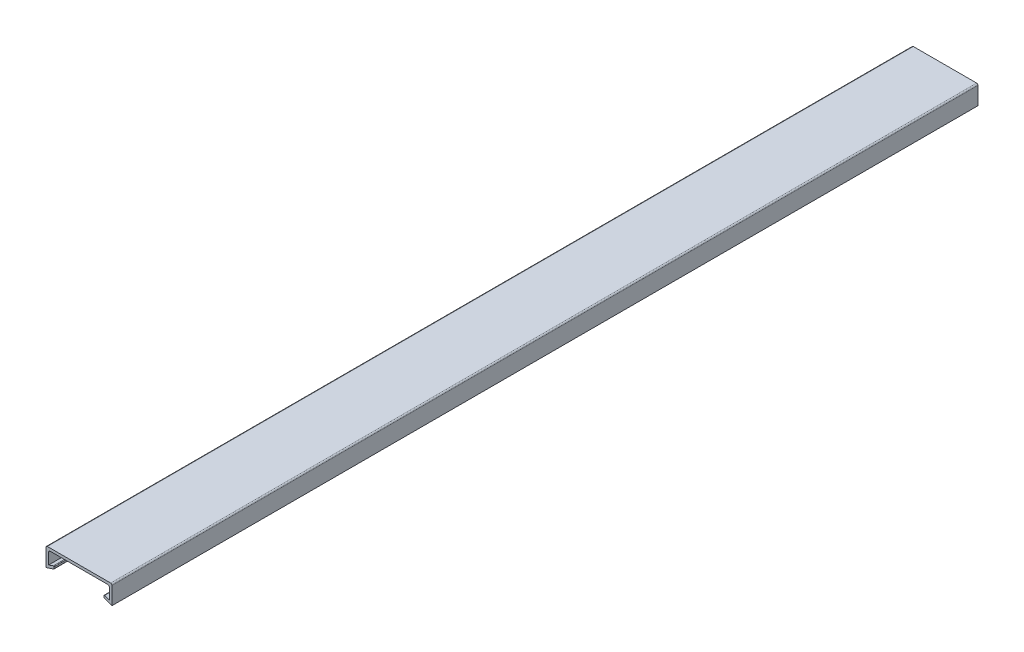
ISO-10303-21;
HEADER;
FILE_DESCRIPTION(('STEP AP214'),'2;1');
FILE_NAME('part.step','',(''),(''),'','','');
FILE_SCHEMA(('AUTOMOTIVE_DESIGN { 1 0 10303 214 1 1 1 1 }'));
ENDSEC;
DATA;
#1=APPLICATION_CONTEXT('core data for automotive mechanical design processes');
#2=APPLICATION_PROTOCOL_DEFINITION('international standard','automotive_design',2000,#1);
#3=PRODUCT_CONTEXT('',#1,'mechanical');
#4=PRODUCT('Part','Part','',(#3));
#5=PRODUCT_RELATED_PRODUCT_CATEGORY('part','',(#4));
#6=PRODUCT_DEFINITION_FORMATION('','',#4);
#7=PRODUCT_DEFINITION_CONTEXT('part definition',#1,'design');
#8=PRODUCT_DEFINITION('design','',#6,#7);
#9=PRODUCT_DEFINITION_SHAPE('','',#8);
#10=(LENGTH_UNIT() NAMED_UNIT(*) SI_UNIT(.MILLI.,.METRE.));
#11=(NAMED_UNIT(*) PLANE_ANGLE_UNIT() SI_UNIT($,.RADIAN.));
#12=(NAMED_UNIT(*) SI_UNIT($,.STERADIAN.) SOLID_ANGLE_UNIT());
#13=UNCERTAINTY_MEASURE_WITH_UNIT(LENGTH_MEASURE(1.E-05),#10,'distance_accuracy_value','');
#14=(GEOMETRIC_REPRESENTATION_CONTEXT(3) GLOBAL_UNCERTAINTY_ASSIGNED_CONTEXT((#13)) GLOBAL_UNIT_ASSIGNED_CONTEXT((#10,
#11,#12)) REPRESENTATION_CONTEXT('',''));
#15=CARTESIAN_POINT('',(0.,0.,0.));
#16=DIRECTION('',(0.,0.,1.));
#17=DIRECTION('',(1.,0.,0.));
#18=AXIS2_PLACEMENT_3D('',#15,#16,#17);
#19=CARTESIAN_POINT('',(-12.2,-7.,160.));
#20=DIRECTION('',(1.,0.,0.));
#21=DIRECTION('',(0.,0.,-1.));
#22=AXIS2_PLACEMENT_3D('',#19,#20,#21);
#23=PLANE('',#22);
#24=DIRECTION('',(0.,-1.,0.));
#25=VECTOR('',#24,1.);
#26=CARTESIAN_POINT('',(-12.2,-7.,-160.));
#27=LINE('',#26,#25);
#28=CARTESIAN_POINT('',(-12.2,-0.5,-160.));
#29=VERTEX_POINT('',#28);
#30=CARTESIAN_POINT('',(-12.2,-7.,-160.));
#31=VERTEX_POINT('',#30);
#32=EDGE_CURVE('E201',#29,#31,#27,.T.);
#33=ORIENTED_EDGE('',*,*,#32,.T.);
#34=DIRECTION('',(0.,0.,-1.));
#35=VECTOR('',#34,1.);
#36=CARTESIAN_POINT('',(-12.2,-7.,160.));
#37=LINE('',#36,#35);
#38=CARTESIAN_POINT('',(-12.2,-7.,160.));
#39=VERTEX_POINT('',#38);
#40=EDGE_CURVE('E11',#39,#31,#37,.T.);
#41=ORIENTED_EDGE('',*,*,#40,.F.);
#42=DIRECTION('',(0.,-1.,0.));
#43=VECTOR('',#42,1.);
#44=CARTESIAN_POINT('',(-12.2,-7.,160.));
#45=LINE('',#44,#43);
#46=CARTESIAN_POINT('',(-12.2,-0.5,160.));
#47=VERTEX_POINT('',#46);
#48=EDGE_CURVE('E239',#47,#39,#45,.T.);
#49=ORIENTED_EDGE('',*,*,#48,.F.);
#50=DIRECTION('',(0.,0.,-1.));
#51=VECTOR('',#50,1.);
#52=CARTESIAN_POINT('',(-12.2,-0.5,160.));
#53=LINE('',#52,#51);
#54=EDGE_CURVE('E197',#47,#29,#53,.T.);
#55=ORIENTED_EDGE('',*,*,#54,.T.);
#56=EDGE_LOOP('',(#33,#41,#49,#55));
#57=FACE_BOUND('',#56,.T.);
#58=ADVANCED_FACE('F33',(#57),#23,.F.);
#59=CARTESIAN_POINT('',(-9.33675444679663,-6.04558481559888,160.));
#60=DIRECTION('',(-0.316227766016838,0.948683298050514,0.));
#61=DIRECTION('',(-0.948683298050514,-0.316227766016838,0.));
#62=AXIS2_PLACEMENT_3D('',#59,#60,#61);
#63=PLANE('',#62);
#64=DIRECTION('',(0.948683298050514,0.316227766016838,0.));
#65=VECTOR('',#64,1.);
#66=CARTESIAN_POINT('',(-9.33675444679663,-6.04558481559888,-160.));
#67=LINE('',#66,#65);
#68=CARTESIAN_POINT('',(-9.33675444679663,-6.04558481559888,-160.));
#69=VERTEX_POINT('',#68);
#70=EDGE_CURVE('E204',#31,#69,#67,.T.);
#71=ORIENTED_EDGE('',*,*,#70,.T.);
#72=DIRECTION('',(0.,0.,-1.));
#73=VECTOR('',#72,1.);
#74=CARTESIAN_POINT('',(-9.33675444679663,-6.04558481559888,160.));
#75=LINE('',#74,#73);
#76=CARTESIAN_POINT('',(-9.33675444679663,-6.04558481559888,160.));
#77=VERTEX_POINT('',#76);
#78=EDGE_CURVE('E41',#77,#69,#75,.T.);
#79=ORIENTED_EDGE('',*,*,#78,.F.);
#80=DIRECTION('',(0.948683298050514,0.316227766016838,0.));
#81=VECTOR('',#80,1.);
#82=CARTESIAN_POINT('',(-9.33675444679663,-6.04558481559888,160.));
#83=LINE('',#82,#81);
#84=EDGE_CURVE('E128',#39,#77,#83,.T.);
#85=ORIENTED_EDGE('',*,*,#84,.F.);
#86=ORIENTED_EDGE('',*,*,#40,.T.);
#87=EDGE_LOOP('',(#71,#79,#85,#86));
#88=FACE_BOUND('',#87,.T.);
#89=ADVANCED_FACE('F357',(#88),#63,.F.);
#90=CARTESIAN_POINT('',(-9.4,-5.85584815598877,160.));
#91=DIRECTION('',(0.,0.,-1.));
#92=DIRECTION('',(-1.,0.,0.));
#93=AXIS2_PLACEMENT_3D('',#90,#91,#92);
#94=CYLINDRICAL_SURFACE('',#93,0.199999999999999);
#95=CARTESIAN_POINT('',(-9.4,-5.85584815598877,-160.));
#96=DIRECTION('',(0.,0.,1.));
#97=DIRECTION('',(1.,0.,0.));
#98=AXIS2_PLACEMENT_3D('',#95,#96,#97);
#99=CIRCLE('',#98,0.199999999999999);
#100=CARTESIAN_POINT('',(-9.2,-5.85584815598877,-160.));
#101=VERTEX_POINT('',#100);
#102=EDGE_CURVE('E206',#69,#101,#99,.T.);
#103=ORIENTED_EDGE('',*,*,#102,.T.);
#104=DIRECTION('',(0.,0.,-1.));
#105=VECTOR('',#104,1.);
#106=CARTESIAN_POINT('',(-9.2,-5.85584815598877,160.));
#107=LINE('',#106,#105);
#108=CARTESIAN_POINT('',(-9.2,-5.85584815598877,160.));
#109=VERTEX_POINT('',#108);
#110=EDGE_CURVE('E282',#109,#101,#107,.T.);
#111=ORIENTED_EDGE('',*,*,#110,.F.);
#112=CARTESIAN_POINT('',(-9.4,-5.85584815598877,160.));
#113=DIRECTION('',(0.,0.,1.));
#114=DIRECTION('',(1.,0.,0.));
#115=AXIS2_PLACEMENT_3D('',#112,#113,#114);
#116=CIRCLE('',#115,0.199999999999999);
#117=EDGE_CURVE('E290',#77,#109,#116,.T.);
#118=ORIENTED_EDGE('',*,*,#117,.F.);
#119=ORIENTED_EDGE('',*,*,#78,.T.);
#120=EDGE_LOOP('',(#103,#111,#118,#119));
#121=FACE_BOUND('',#120,.T.);
#122=ADVANCED_FACE('F288',(#121),#94,.T.);
#123=CARTESIAN_POINT('',(-9.2,-5.27748517734455,160.));
#124=DIRECTION('',(-1.,0.,0.));
#125=DIRECTION('',(0.,0.,1.));
#126=AXIS2_PLACEMENT_3D('',#123,#124,#125);
#127=PLANE('',#126);
#128=DIRECTION('',(0.,1.,0.));
#129=VECTOR('',#128,1.);
#130=CARTESIAN_POINT('',(-9.2,-5.27748517734455,-160.));
#131=LINE('',#130,#129);
#132=CARTESIAN_POINT('',(-9.2,-5.27748517734455,-160.));
#133=VERTEX_POINT('',#132);
#134=EDGE_CURVE('E208',#101,#133,#131,.T.);
#135=ORIENTED_EDGE('',*,*,#134,.T.);
#136=DIRECTION('',(0.,0.,-1.));
#137=VECTOR('',#136,1.);
#138=CARTESIAN_POINT('',(-9.2,-5.27748517734455,160.));
#139=LINE('',#138,#137);
#140=CARTESIAN_POINT('',(-9.2,-5.27748517734455,160.));
#141=VERTEX_POINT('',#140);
#142=EDGE_CURVE('E279',#141,#133,#139,.T.);
#143=ORIENTED_EDGE('',*,*,#142,.F.);
#144=DIRECTION('',(0.,1.,0.));
#145=VECTOR('',#144,1.);
#146=CARTESIAN_POINT('',(-9.2,-5.27748517734455,160.));
#147=LINE('',#146,#145);
#148=EDGE_CURVE('E308',#109,#141,#147,.T.);
#149=ORIENTED_EDGE('',*,*,#148,.F.);
#150=ORIENTED_EDGE('',*,*,#110,.T.);
#151=EDGE_LOOP('',(#135,#143,#149,#150));
#152=FACE_BOUND('',#151,.T.);
#153=ADVANCED_FACE('F299',(#152),#127,.F.);
#154=CARTESIAN_POINT('',(-9.4,-5.27748517734455,160.));
#155=DIRECTION('',(0.,0.,-1.));
#156=DIRECTION('',(-1.,0.,0.));
#157=AXIS2_PLACEMENT_3D('',#154,#155,#156);
#158=CYLINDRICAL_SURFACE('',#157,0.2);
#159=CARTESIAN_POINT('',(-9.4,-5.27748517734455,-160.));
#160=DIRECTION('',(0.,0.,1.));
#161=DIRECTION('',(-1.,0.,0.));
#162=AXIS2_PLACEMENT_3D('',#159,#160,#161);
#163=CIRCLE('',#162,0.2);
#164=CARTESIAN_POINT('',(-9.46324555320337,-5.08774851773445,-160.));
#165=VERTEX_POINT('',#164);
#166=EDGE_CURVE('E210',#133,#165,#163,.T.);
#167=ORIENTED_EDGE('',*,*,#166,.T.);
#168=DIRECTION('',(0.,0.,-1.));
#169=VECTOR('',#168,1.);
#170=CARTESIAN_POINT('',(-9.46324555320337,-5.08774851773445,160.));
#171=LINE('',#170,#169);
#172=CARTESIAN_POINT('',(-9.46324555320337,-5.08774851773445,160.));
#173=VERTEX_POINT('',#172);
#174=EDGE_CURVE('E276',#173,#165,#171,.T.);
#175=ORIENTED_EDGE('',*,*,#174,.F.);
#176=CARTESIAN_POINT('',(-9.4,-5.27748517734455,160.));
#177=DIRECTION('',(0.,0.,1.));
#178=DIRECTION('',(-1.,0.,0.));
#179=AXIS2_PLACEMENT_3D('',#176,#177,#178);
#180=CIRCLE('',#179,0.2);
#181=EDGE_CURVE('E305',#141,#173,#180,.T.);
#182=ORIENTED_EDGE('',*,*,#181,.F.);
#183=ORIENTED_EDGE('',*,*,#142,.T.);
#184=EDGE_LOOP('',(#167,#175,#182,#183));
#185=FACE_BOUND('',#184,.T.);
#186=ADVANCED_FACE('F303',(#185),#158,.T.);
#187=CARTESIAN_POINT('',(-11.2,-5.66666666666666,160.));
#188=DIRECTION('',(0.316227766016838,-0.948683298050514,0.));
#189=DIRECTION('',(0.948683298050514,0.316227766016839,0.));
#190=AXIS2_PLACEMENT_3D('',#187,#188,#189);
#191=PLANE('',#190);
#192=DIRECTION('',(-0.948683298050514,-0.316227766016838,0.));
#193=VECTOR('',#192,1.);
#194=CARTESIAN_POINT('',(-11.2,-5.66666666666666,-160.));
#195=LINE('',#194,#193);
#196=CARTESIAN_POINT('',(-11.2,-5.66666666666666,-160.));
#197=VERTEX_POINT('',#196);
#198=EDGE_CURVE('E212',#165,#197,#195,.T.);
#199=ORIENTED_EDGE('',*,*,#198,.T.);
#200=DIRECTION('',(0.,0.,-1.));
#201=VECTOR('',#200,1.);
#202=CARTESIAN_POINT('',(-11.2,-5.66666666666666,160.));
#203=LINE('',#202,#201);
#204=CARTESIAN_POINT('',(-11.2,-5.66666666666666,160.));
#205=VERTEX_POINT('',#204);
#206=EDGE_CURVE('E273',#205,#197,#203,.T.);
#207=ORIENTED_EDGE('',*,*,#206,.F.);
#208=DIRECTION('',(-0.948683298050514,-0.316227766016838,0.));
#209=VECTOR('',#208,1.);
#210=CARTESIAN_POINT('',(-11.2,-5.66666666666666,160.));
#211=LINE('',#210,#209);
#212=EDGE_CURVE('E307',#173,#205,#211,.T.);
#213=ORIENTED_EDGE('',*,*,#212,.F.);
#214=ORIENTED_EDGE('',*,*,#174,.T.);
#215=EDGE_LOOP('',(#199,#207,#213,#214));
#216=FACE_BOUND('',#215,.T.);
#217=ADVANCED_FACE('F370',(#216),#191,.F.);
#218=CARTESIAN_POINT('',(-11.2,-1.5,160.));
#219=DIRECTION('',(-1.,0.,0.));
#220=DIRECTION('',(0.,0.,1.));
#221=AXIS2_PLACEMENT_3D('',#218,#219,#220);
#222=PLANE('',#221);
#223=DIRECTION('',(0.,1.,0.));
#224=VECTOR('',#223,1.);
#225=CARTESIAN_POINT('',(-11.2,-1.5,-160.));
#226=LINE('',#225,#224);
#227=CARTESIAN_POINT('',(-11.2,-1.5,-160.));
#228=VERTEX_POINT('',#227);
#229=EDGE_CURVE('E214',#197,#228,#226,.T.);
#230=ORIENTED_EDGE('',*,*,#229,.T.);
#231=DIRECTION('',(0.,0.,-1.));
#232=VECTOR('',#231,1.);
#233=CARTESIAN_POINT('',(-11.2,-1.5,160.));
#234=LINE('',#233,#232);
#235=CARTESIAN_POINT('',(-11.2,-1.5,160.));
#236=VERTEX_POINT('',#235);
#237=EDGE_CURVE('E270',#236,#228,#234,.T.);
#238=ORIENTED_EDGE('',*,*,#237,.F.);
#239=DIRECTION('',(0.,1.,0.));
#240=VECTOR('',#239,1.);
#241=CARTESIAN_POINT('',(-11.2,-1.5,160.));
#242=LINE('',#241,#240);
#243=EDGE_CURVE('E310',#205,#236,#242,.T.);
#244=ORIENTED_EDGE('',*,*,#243,.F.);
#245=ORIENTED_EDGE('',*,*,#206,.T.);
#246=EDGE_LOOP('',(#230,#238,#244,#245));
#247=FACE_BOUND('',#246,.T.);
#248=ADVANCED_FACE('F373',(#247),#222,.F.);
#249=CARTESIAN_POINT('',(-10.7,-1.5,160.));
#250=DIRECTION('',(0.,0.,-1.));
#251=DIRECTION('',(-1.,0.,0.));
#252=AXIS2_PLACEMENT_3D('',#249,#250,#251);
#253=CYLINDRICAL_SURFACE('',#252,0.5);
#254=CARTESIAN_POINT('',(-10.7,-1.5,-160.));
#255=DIRECTION('',(0.,0.,-1.));
#256=DIRECTION('',(1.,0.,0.));
#257=AXIS2_PLACEMENT_3D('',#254,#255,#256);
#258=CIRCLE('',#257,0.5);
#259=CARTESIAN_POINT('',(-10.7,-1.,-160.));
#260=VERTEX_POINT('',#259);
#261=EDGE_CURVE('E216',#228,#260,#258,.T.);
#262=ORIENTED_EDGE('',*,*,#261,.T.);
#263=DIRECTION('',(0.,0.,-1.));
#264=VECTOR('',#263,1.);
#265=CARTESIAN_POINT('',(-10.7,-1.,160.));
#266=LINE('',#265,#264);
#267=CARTESIAN_POINT('',(-10.7,-1.,160.));
#268=VERTEX_POINT('',#267);
#269=EDGE_CURVE('E267',#268,#260,#266,.T.);
#270=ORIENTED_EDGE('',*,*,#269,.F.);
#271=CARTESIAN_POINT('',(-10.7,-1.5,160.));
#272=DIRECTION('',(0.,0.,-1.));
#273=DIRECTION('',(1.,0.,0.));
#274=AXIS2_PLACEMENT_3D('',#271,#272,#273);
#275=CIRCLE('',#274,0.5);
#276=EDGE_CURVE('E316',#236,#268,#275,.T.);
#277=ORIENTED_EDGE('',*,*,#276,.F.);
#278=ORIENTED_EDGE('',*,*,#237,.T.);
#279=EDGE_LOOP('',(#262,#270,#277,#278));
#280=FACE_BOUND('',#279,.T.);
#281=ADVANCED_FACE('F377',(#280),#253,.F.);
#282=CARTESIAN_POINT('',(10.7,-1.,160.));
#283=DIRECTION('',(0.,1.,0.));
#284=DIRECTION('',(-1.,0.,0.));
#285=AXIS2_PLACEMENT_3D('',#282,#283,#284);
#286=PLANE('',#285);
#287=DIRECTION('',(1.,0.,0.));
#288=VECTOR('',#287,1.);
#289=CARTESIAN_POINT('',(10.7,-1.,-160.));
#290=LINE('',#289,#288);
#291=CARTESIAN_POINT('',(10.7,-1.,-160.));
#292=VERTEX_POINT('',#291);
#293=EDGE_CURVE('E218',#260,#292,#290,.T.);
#294=ORIENTED_EDGE('',*,*,#293,.T.);
#295=DIRECTION('',(0.,0.,-1.));
#296=VECTOR('',#295,1.);
#297=CARTESIAN_POINT('',(10.7,-1.,160.));
#298=LINE('',#297,#296);
#299=CARTESIAN_POINT('',(10.7,-1.,160.));
#300=VERTEX_POINT('',#299);
#301=EDGE_CURVE('E264',#300,#292,#298,.T.);
#302=ORIENTED_EDGE('',*,*,#301,.F.);
#303=DIRECTION('',(1.,0.,0.));
#304=VECTOR('',#303,1.);
#305=CARTESIAN_POINT('',(10.7,-1.,160.));
#306=LINE('',#305,#304);
#307=EDGE_CURVE('E318',#268,#300,#306,.T.);
#308=ORIENTED_EDGE('',*,*,#307,.F.);
#309=ORIENTED_EDGE('',*,*,#269,.T.);
#310=EDGE_LOOP('',(#294,#302,#308,#309));
#311=FACE_BOUND('',#310,.T.);
#312=ADVANCED_FACE('F381',(#311),#286,.F.);
#313=CARTESIAN_POINT('',(10.7,-1.5,160.));
#314=DIRECTION('',(0.,0.,-1.));
#315=DIRECTION('',(-1.,0.,0.));
#316=AXIS2_PLACEMENT_3D('',#313,#314,#315);
#317=CYLINDRICAL_SURFACE('',#316,0.5);
#318=CARTESIAN_POINT('',(10.7,-1.5,-160.));
#319=DIRECTION('',(0.,0.,-1.));
#320=DIRECTION('',(1.,0.,0.));
#321=AXIS2_PLACEMENT_3D('',#318,#319,#320);
#322=CIRCLE('',#321,0.5);
#323=CARTESIAN_POINT('',(11.2,-1.5,-160.));
#324=VERTEX_POINT('',#323);
#325=EDGE_CURVE('E220',#292,#324,#322,.T.);
#326=ORIENTED_EDGE('',*,*,#325,.T.);
#327=DIRECTION('',(0.,0.,-1.));
#328=VECTOR('',#327,1.);
#329=CARTESIAN_POINT('',(11.2,-1.5,160.));
#330=LINE('',#329,#328);
#331=CARTESIAN_POINT('',(11.2,-1.5,160.));
#332=VERTEX_POINT('',#331);
#333=EDGE_CURVE('E261',#332,#324,#330,.T.);
#334=ORIENTED_EDGE('',*,*,#333,.F.);
#335=CARTESIAN_POINT('',(10.7,-1.5,160.));
#336=DIRECTION('',(0.,0.,-1.));
#337=DIRECTION('',(1.,0.,0.));
#338=AXIS2_PLACEMENT_3D('',#335,#336,#337);
#339=CIRCLE('',#338,0.5);
#340=EDGE_CURVE('E320',#300,#332,#339,.T.);
#341=ORIENTED_EDGE('',*,*,#340,.F.);
#342=ORIENTED_EDGE('',*,*,#301,.T.);
#343=EDGE_LOOP('',(#326,#334,#341,#342));
#344=FACE_BOUND('',#343,.T.);
#345=ADVANCED_FACE('F385',(#344),#317,.F.);
#346=CARTESIAN_POINT('',(11.2,-5.66666666666666,160.));
#347=DIRECTION('',(1.,0.,0.));
#348=DIRECTION('',(0.,0.,-1.));
#349=AXIS2_PLACEMENT_3D('',#346,#347,#348);
#350=PLANE('',#349);
#351=DIRECTION('',(0.,-1.,0.));
#352=VECTOR('',#351,1.);
#353=CARTESIAN_POINT('',(11.2,-5.66666666666666,-160.));
#354=LINE('',#353,#352);
#355=CARTESIAN_POINT('',(11.2,-5.66666666666666,-160.));
#356=VERTEX_POINT('',#355);
#357=EDGE_CURVE('E222',#324,#356,#354,.T.);
#358=ORIENTED_EDGE('',*,*,#357,.T.);
#359=DIRECTION('',(0.,0.,-1.));
#360=VECTOR('',#359,1.);
#361=CARTESIAN_POINT('',(11.2,-5.66666666666666,160.));
#362=LINE('',#361,#360);
#363=CARTESIAN_POINT('',(11.2,-5.66666666666666,160.));
#364=VERTEX_POINT('',#363);
#365=EDGE_CURVE('E258',#364,#356,#362,.T.);
#366=ORIENTED_EDGE('',*,*,#365,.F.);
#367=DIRECTION('',(0.,-1.,0.));
#368=VECTOR('',#367,1.);
#369=CARTESIAN_POINT('',(11.2,-5.66666666666666,160.));
#370=LINE('',#369,#368);
#371=EDGE_CURVE('E322',#332,#364,#370,.T.);
#372=ORIENTED_EDGE('',*,*,#371,.F.);
#373=ORIENTED_EDGE('',*,*,#333,.T.);
#374=EDGE_LOOP('',(#358,#366,#372,#373));
#375=FACE_BOUND('',#374,.T.);
#376=ADVANCED_FACE('F389',(#375),#350,.F.);
#377=CARTESIAN_POINT('',(11.2,-5.66666666666666,160.));
#378=DIRECTION('',(-0.316227766016838,-0.948683298050514,0.));
#379=DIRECTION('',(0.948683298050514,-0.316227766016839,0.));
#380=AXIS2_PLACEMENT_3D('',#377,#378,#379);
#381=PLANE('',#380);
#382=DIRECTION('',(-0.948683298050514,0.316227766016838,0.));
#383=VECTOR('',#382,1.);
#384=CARTESIAN_POINT('',(11.2,-5.66666666666666,-160.));
#385=LINE('',#384,#383);
#386=CARTESIAN_POINT('',(9.46324555320337,-5.08774851773445,-160.));
#387=VERTEX_POINT('',#386);
#388=EDGE_CURVE('E224',#356,#387,#385,.T.);
#389=ORIENTED_EDGE('',*,*,#388,.T.);
#390=DIRECTION('',(0.,0.,-1.));
#391=VECTOR('',#390,1.);
#392=CARTESIAN_POINT('',(9.46324555320337,-5.08774851773445,160.));
#393=LINE('',#392,#391);
#394=CARTESIAN_POINT('',(9.46324555320337,-5.08774851773445,160.));
#395=VERTEX_POINT('',#394);
#396=EDGE_CURVE('E255',#395,#387,#393,.T.);
#397=ORIENTED_EDGE('',*,*,#396,.F.);
#398=DIRECTION('',(-0.948683298050514,0.316227766016838,0.));
#399=VECTOR('',#398,1.);
#400=CARTESIAN_POINT('',(11.2,-5.66666666666666,160.));
#401=LINE('',#400,#399);
#402=EDGE_CURVE('E324',#364,#395,#401,.T.);
#403=ORIENTED_EDGE('',*,*,#402,.F.);
#404=ORIENTED_EDGE('',*,*,#365,.T.);
#405=EDGE_LOOP('',(#389,#397,#403,#404));
#406=FACE_BOUND('',#405,.T.);
#407=ADVANCED_FACE('F393',(#406),#381,.F.);
#408=CARTESIAN_POINT('',(9.4,-5.27748517734455,160.));
#409=DIRECTION('',(0.,0.,-1.));
#410=DIRECTION('',(-1.,0.,0.));
#411=AXIS2_PLACEMENT_3D('',#408,#409,#410);
#412=CYLINDRICAL_SURFACE('',#411,0.2);
#413=CARTESIAN_POINT('',(9.4,-5.27748517734455,-160.));
#414=DIRECTION('',(0.,0.,1.));
#415=DIRECTION('',(-1.,0.,0.));
#416=AXIS2_PLACEMENT_3D('',#413,#414,#415);
#417=CIRCLE('',#416,0.2);
#418=CARTESIAN_POINT('',(9.2,-5.27748517734455,-160.));
#419=VERTEX_POINT('',#418);
#420=EDGE_CURVE('E226',#387,#419,#417,.T.);
#421=ORIENTED_EDGE('',*,*,#420,.T.);
#422=DIRECTION('',(0.,0.,-1.));
#423=VECTOR('',#422,1.);
#424=CARTESIAN_POINT('',(9.2,-5.27748517734455,160.));
#425=LINE('',#424,#423);
#426=CARTESIAN_POINT('',(9.2,-5.27748517734455,160.));
#427=VERTEX_POINT('',#426);
#428=EDGE_CURVE('E252',#427,#419,#425,.T.);
#429=ORIENTED_EDGE('',*,*,#428,.F.);
#430=CARTESIAN_POINT('',(9.4,-5.27748517734455,160.));
#431=DIRECTION('',(0.,0.,1.));
#432=DIRECTION('',(-1.,0.,0.));
#433=AXIS2_PLACEMENT_3D('',#430,#431,#432);
#434=CIRCLE('',#433,0.2);
#435=EDGE_CURVE('E326',#395,#427,#434,.T.);
#436=ORIENTED_EDGE('',*,*,#435,.F.);
#437=ORIENTED_EDGE('',*,*,#396,.T.);
#438=EDGE_LOOP('',(#421,#429,#436,#437));
#439=FACE_BOUND('',#438,.T.);
#440=ADVANCED_FACE('F397',(#439),#412,.T.);
#441=CARTESIAN_POINT('',(9.2,-5.27748517734455,160.));
#442=DIRECTION('',(1.,0.,0.));
#443=DIRECTION('',(0.,0.,-1.));
#444=AXIS2_PLACEMENT_3D('',#441,#442,#443);
#445=PLANE('',#444);
#446=DIRECTION('',(0.,-1.,0.));
#447=VECTOR('',#446,1.);
#448=CARTESIAN_POINT('',(9.2,-5.27748517734455,-160.));
#449=LINE('',#448,#447);
#450=CARTESIAN_POINT('',(9.2,-5.85584815598877,-160.));
#451=VERTEX_POINT('',#450);
#452=EDGE_CURVE('E228',#419,#451,#449,.T.);
#453=ORIENTED_EDGE('',*,*,#452,.T.);
#454=DIRECTION('',(0.,0.,-1.));
#455=VECTOR('',#454,1.);
#456=CARTESIAN_POINT('',(9.2,-5.85584815598877,160.));
#457=LINE('',#456,#455);
#458=CARTESIAN_POINT('',(9.2,-5.85584815598877,160.));
#459=VERTEX_POINT('',#458);
#460=EDGE_CURVE('E249',#459,#451,#457,.T.);
#461=ORIENTED_EDGE('',*,*,#460,.F.);
#462=DIRECTION('',(0.,-1.,0.));
#463=VECTOR('',#462,1.);
#464=CARTESIAN_POINT('',(9.2,-5.27748517734455,160.));
#465=LINE('',#464,#463);
#466=EDGE_CURVE('E328',#427,#459,#465,.T.);
#467=ORIENTED_EDGE('',*,*,#466,.F.);
#468=ORIENTED_EDGE('',*,*,#428,.T.);
#469=EDGE_LOOP('',(#453,#461,#467,#468));
#470=FACE_BOUND('',#469,.T.);
#471=ADVANCED_FACE('F401',(#470),#445,.F.);
#472=CARTESIAN_POINT('',(9.4,-5.85584815598877,160.));
#473=DIRECTION('',(0.,0.,-1.));
#474=DIRECTION('',(-1.,0.,0.));
#475=AXIS2_PLACEMENT_3D('',#472,#473,#474);
#476=CYLINDRICAL_SURFACE('',#475,0.199999999999999);
#477=CARTESIAN_POINT('',(9.4,-5.85584815598877,-160.));
#478=DIRECTION('',(0.,0.,1.));
#479=DIRECTION('',(1.,0.,0.));
#480=AXIS2_PLACEMENT_3D('',#477,#478,#479);
#481=CIRCLE('',#480,0.199999999999999);
#482=CARTESIAN_POINT('',(9.33675444679663,-6.04558481559888,-160.));
#483=VERTEX_POINT('',#482);
#484=EDGE_CURVE('E230',#451,#483,#481,.T.);
#485=ORIENTED_EDGE('',*,*,#484,.T.);
#486=DIRECTION('',(0.,0.,-1.));
#487=VECTOR('',#486,1.);
#488=CARTESIAN_POINT('',(9.33675444679663,-6.04558481559888,160.));
#489=LINE('',#488,#487);
#490=CARTESIAN_POINT('',(9.33675444679663,-6.04558481559888,160.));
#491=VERTEX_POINT('',#490);
#492=EDGE_CURVE('E246',#491,#483,#489,.T.);
#493=ORIENTED_EDGE('',*,*,#492,.F.);
#494=CARTESIAN_POINT('',(9.4,-5.85584815598877,160.));
#495=DIRECTION('',(0.,0.,1.));
#496=DIRECTION('',(1.,0.,0.));
#497=AXIS2_PLACEMENT_3D('',#494,#495,#496);
#498=CIRCLE('',#497,0.199999999999999);
#499=EDGE_CURVE('E330',#459,#491,#498,.T.);
#500=ORIENTED_EDGE('',*,*,#499,.F.);
#501=ORIENTED_EDGE('',*,*,#460,.T.);
#502=EDGE_LOOP('',(#485,#493,#500,#501));
#503=FACE_BOUND('',#502,.T.);
#504=ADVANCED_FACE('F405',(#503),#476,.T.);
#505=CARTESIAN_POINT('',(9.33675444679663,-6.04558481559888,160.));
#506=DIRECTION('',(0.316227766016838,0.948683298050514,0.));
#507=DIRECTION('',(-0.948683298050514,0.316227766016838,0.));
#508=AXIS2_PLACEMENT_3D('',#505,#506,#507);
#509=PLANE('',#508);
#510=DIRECTION('',(0.948683298050514,-0.316227766016838,0.));
#511=VECTOR('',#510,1.);
#512=CARTESIAN_POINT('',(9.33675444679663,-6.04558481559888,-160.));
#513=LINE('',#512,#511);
#514=CARTESIAN_POINT('',(12.2,-7.,-160.));
#515=VERTEX_POINT('',#514);
#516=EDGE_CURVE('E232',#483,#515,#513,.T.);
#517=ORIENTED_EDGE('',*,*,#516,.T.);
#518=DIRECTION('',(0.,0.,-1.));
#519=VECTOR('',#518,1.);
#520=CARTESIAN_POINT('',(12.2,-7.,160.));
#521=LINE('',#520,#519);
#522=CARTESIAN_POINT('',(12.2,-7.,160.));
#523=VERTEX_POINT('',#522);
#524=EDGE_CURVE('E243',#523,#515,#521,.T.);
#525=ORIENTED_EDGE('',*,*,#524,.F.);
#526=DIRECTION('',(0.948683298050514,-0.316227766016838,0.));
#527=VECTOR('',#526,1.);
#528=CARTESIAN_POINT('',(9.33675444679663,-6.04558481559888,160.));
#529=LINE('',#528,#527);
#530=EDGE_CURVE('E332',#491,#523,#529,.T.);
#531=ORIENTED_EDGE('',*,*,#530,.F.);
#532=ORIENTED_EDGE('',*,*,#492,.T.);
#533=EDGE_LOOP('',(#517,#525,#531,#532));
#534=FACE_BOUND('',#533,.T.);
#535=ADVANCED_FACE('F338',(#534),#509,.F.);
#536=CARTESIAN_POINT('',(12.2,-0.5,160.));
#537=DIRECTION('',(-1.,0.,0.));
#538=DIRECTION('',(0.,0.,1.));
#539=AXIS2_PLACEMENT_3D('',#536,#537,#538);
#540=PLANE('',#539);
#541=DIRECTION('',(0.,1.,0.));
#542=VECTOR('',#541,1.);
#543=CARTESIAN_POINT('',(12.2,-0.5,-160.));
#544=LINE('',#543,#542);
#545=CARTESIAN_POINT('',(12.2,-0.5,-160.));
#546=VERTEX_POINT('',#545);
#547=EDGE_CURVE('E234',#515,#546,#544,.T.);
#548=ORIENTED_EDGE('',*,*,#547,.T.);
#549=DIRECTION('',(0.,0.,-1.));
#550=VECTOR('',#549,1.);
#551=CARTESIAN_POINT('',(12.2,-0.5,160.));
#552=LINE('',#551,#550);
#553=CARTESIAN_POINT('',(12.2,-0.5,160.));
#554=VERTEX_POINT('',#553);
#555=EDGE_CURVE('E192',#554,#546,#552,.T.);
#556=ORIENTED_EDGE('',*,*,#555,.F.);
#557=DIRECTION('',(0.,1.,0.));
#558=VECTOR('',#557,1.);
#559=CARTESIAN_POINT('',(12.2,-0.5,160.));
#560=LINE('',#559,#558);
#561=EDGE_CURVE('E183',#523,#554,#560,.T.);
#562=ORIENTED_EDGE('',*,*,#561,.F.);
#563=ORIENTED_EDGE('',*,*,#524,.T.);
#564=EDGE_LOOP('',(#548,#556,#562,#563));
#565=FACE_BOUND('',#564,.T.);
#566=ADVANCED_FACE('F342',(#565),#540,.F.);
#567=CARTESIAN_POINT('',(11.7,-0.5,160.));
#568=DIRECTION('',(0.,0.,-1.));
#569=DIRECTION('',(-1.,0.,0.));
#570=AXIS2_PLACEMENT_3D('',#567,#568,#569);
#571=CYLINDRICAL_SURFACE('',#570,0.5);
#572=CARTESIAN_POINT('',(11.7,-0.5,-160.));
#573=DIRECTION('',(0.,0.,1.));
#574=DIRECTION('',(-1.,0.,0.));
#575=AXIS2_PLACEMENT_3D('',#572,#573,#574);
#576=CIRCLE('',#575,0.5);
#577=CARTESIAN_POINT('',(11.7,0.,-160.));
#578=VERTEX_POINT('',#577);
#579=EDGE_CURVE('E191',#546,#578,#576,.T.);
#580=ORIENTED_EDGE('',*,*,#579,.T.);
#581=DIRECTION('',(0.,0.,-1.));
#582=VECTOR('',#581,1.);
#583=CARTESIAN_POINT('',(11.7,0.,160.));
#584=LINE('',#583,#582);
#585=CARTESIAN_POINT('',(11.7,0.,160.));
#586=VERTEX_POINT('',#585);
#587=EDGE_CURVE('E188',#586,#578,#584,.T.);
#588=ORIENTED_EDGE('',*,*,#587,.F.);
#589=CARTESIAN_POINT('',(11.7,-0.5,160.));
#590=DIRECTION('',(0.,0.,1.));
#591=DIRECTION('',(-1.,0.,0.));
#592=AXIS2_PLACEMENT_3D('',#589,#590,#591);
#593=CIRCLE('',#592,0.5);
#594=EDGE_CURVE('E177',#554,#586,#593,.T.);
#595=ORIENTED_EDGE('',*,*,#594,.F.);
#596=ORIENTED_EDGE('',*,*,#555,.T.);
#597=EDGE_LOOP('',(#580,#588,#595,#596));
#598=FACE_BOUND('',#597,.T.);
#599=ADVANCED_FACE('F189',(#598),#571,.T.);
#600=CARTESIAN_POINT('',(-11.7,0.,160.));
#601=DIRECTION('',(0.,-1.,0.));
#602=DIRECTION('',(0.,0.,-1.));
#603=AXIS2_PLACEMENT_3D('',#600,#601,#602);
#604=PLANE('',#603);
#605=DIRECTION('',(-1.,0.,0.));
#606=VECTOR('',#605,1.);
#607=CARTESIAN_POINT('',(-11.7,0.,-160.));
#608=LINE('',#607,#606);
#609=CARTESIAN_POINT('',(-11.7,0.,-160.));
#610=VERTEX_POINT('',#609);
#611=EDGE_CURVE('E114',#578,#610,#608,.T.);
#612=ORIENTED_EDGE('',*,*,#611,.T.);
#613=DIRECTION('',(0.,0.,-1.));
#614=VECTOR('',#613,1.);
#615=CARTESIAN_POINT('',(-11.7,0.,160.));
#616=LINE('',#615,#614);
#617=CARTESIAN_POINT('',(-11.7,0.,160.));
#618=VERTEX_POINT('',#617);
#619=EDGE_CURVE('E193',#618,#610,#616,.T.);
#620=ORIENTED_EDGE('',*,*,#619,.F.);
#621=DIRECTION('',(-1.,0.,0.));
#622=VECTOR('',#621,1.);
#623=CARTESIAN_POINT('',(-11.7,0.,160.));
#624=LINE('',#623,#622);
#625=EDGE_CURVE('E181',#586,#618,#624,.T.);
#626=ORIENTED_EDGE('',*,*,#625,.F.);
#627=ORIENTED_EDGE('',*,*,#587,.T.);
#628=EDGE_LOOP('',(#612,#620,#626,#627));
#629=FACE_BOUND('',#628,.T.);
#630=ADVANCED_FACE('F195',(#629),#604,.F.);
#631=CARTESIAN_POINT('',(-11.7,-0.5,160.));
#632=DIRECTION('',(0.,0.,-1.));
#633=DIRECTION('',(-1.,0.,0.));
#634=AXIS2_PLACEMENT_3D('',#631,#632,#633);
#635=CYLINDRICAL_SURFACE('',#634,0.5);
#636=CARTESIAN_POINT('',(-11.7,-0.5,-160.));
#637=DIRECTION('',(0.,0.,1.));
#638=DIRECTION('',(-1.,0.,0.));
#639=AXIS2_PLACEMENT_3D('',#636,#637,#638);
#640=CIRCLE('',#639,0.5);
#641=EDGE_CURVE('E120',#610,#29,#640,.T.);
#642=ORIENTED_EDGE('',*,*,#641,.T.);
#643=ORIENTED_EDGE('',*,*,#54,.F.);
#644=CARTESIAN_POINT('',(-11.7,-0.5,160.));
#645=DIRECTION('',(0.,0.,1.));
#646=DIRECTION('',(-1.,0.,0.));
#647=AXIS2_PLACEMENT_3D('',#644,#645,#646);
#648=CIRCLE('',#647,0.5);
#649=EDGE_CURVE('E49',#618,#47,#648,.T.);
#650=ORIENTED_EDGE('',*,*,#649,.F.);
#651=ORIENTED_EDGE('',*,*,#619,.T.);
#652=EDGE_LOOP('',(#642,#643,#650,#651));
#653=FACE_BOUND('',#652,.T.);
#654=ADVANCED_FACE('F346',(#653),#635,.T.);
#655=CARTESIAN_POINT('',(-11.7,-0.5,160.));
#656=DIRECTION('',(0.,0.,-1.));
#657=DIRECTION('',(-1.,0.,0.));
#658=AXIS2_PLACEMENT_3D('',#655,#656,#657);
#659=PLANE('',#658);
#660=ORIENTED_EDGE('',*,*,#48,.T.);
#661=ORIENTED_EDGE('',*,*,#84,.T.);
#662=ORIENTED_EDGE('',*,*,#117,.T.);
#663=ORIENTED_EDGE('',*,*,#148,.T.);
#664=ORIENTED_EDGE('',*,*,#181,.T.);
#665=ORIENTED_EDGE('',*,*,#212,.T.);
#666=ORIENTED_EDGE('',*,*,#243,.T.);
#667=ORIENTED_EDGE('',*,*,#276,.T.);
#668=ORIENTED_EDGE('',*,*,#307,.T.);
#669=ORIENTED_EDGE('',*,*,#340,.T.);
#670=ORIENTED_EDGE('',*,*,#371,.T.);
#671=ORIENTED_EDGE('',*,*,#402,.T.);
#672=ORIENTED_EDGE('',*,*,#435,.T.);
#673=ORIENTED_EDGE('',*,*,#466,.T.);
#674=ORIENTED_EDGE('',*,*,#499,.T.);
#675=ORIENTED_EDGE('',*,*,#530,.T.);
#676=ORIENTED_EDGE('',*,*,#561,.T.);
#677=ORIENTED_EDGE('',*,*,#594,.T.);
#678=ORIENTED_EDGE('',*,*,#625,.T.);
#679=ORIENTED_EDGE('',*,*,#649,.T.);
#680=EDGE_LOOP('',(#660,#661,#662,#663,#664,#665,#666,#667,#668,#669,#670,#671,#672,#673,#674,
#675,#676,#677,#678,#679));
#681=FACE_BOUND('',#680,.T.);
#682=ADVANCED_FACE('F179',(#681),#659,.F.);
#683=CARTESIAN_POINT('',(-11.7,-0.5,-160.));
#684=DIRECTION('',(0.,0.,-1.));
#685=DIRECTION('',(-1.,0.,0.));
#686=AXIS2_PLACEMENT_3D('',#683,#684,#685);
#687=PLANE('',#686);
#688=ORIENTED_EDGE('',*,*,#32,.F.);
#689=ORIENTED_EDGE('',*,*,#641,.F.);
#690=ORIENTED_EDGE('',*,*,#611,.F.);
#691=ORIENTED_EDGE('',*,*,#579,.F.);
#692=ORIENTED_EDGE('',*,*,#547,.F.);
#693=ORIENTED_EDGE('',*,*,#516,.F.);
#694=ORIENTED_EDGE('',*,*,#484,.F.);
#695=ORIENTED_EDGE('',*,*,#452,.F.);
#696=ORIENTED_EDGE('',*,*,#420,.F.);
#697=ORIENTED_EDGE('',*,*,#388,.F.);
#698=ORIENTED_EDGE('',*,*,#357,.F.);
#699=ORIENTED_EDGE('',*,*,#325,.F.);
#700=ORIENTED_EDGE('',*,*,#293,.F.);
#701=ORIENTED_EDGE('',*,*,#261,.F.);
#702=ORIENTED_EDGE('',*,*,#229,.F.);
#703=ORIENTED_EDGE('',*,*,#198,.F.);
#704=ORIENTED_EDGE('',*,*,#166,.F.);
#705=ORIENTED_EDGE('',*,*,#134,.F.);
#706=ORIENTED_EDGE('',*,*,#102,.F.);
#707=ORIENTED_EDGE('',*,*,#70,.F.);
#708=EDGE_LOOP('',(#688,#689,#690,#691,#692,#693,#694,#695,#696,#697,#698,#699,#700,#701,#702,
#703,#704,#705,#706,#707));
#709=FACE_BOUND('',#708,.T.);
#710=ADVANCED_FACE('F294',(#709),#687,.T.);
#711=CLOSED_SHELL('',(#58,#89,#122,#153,#186,#217,#248,#281,#312,#345,#376,#407,#440,#471,#504,
#535,#566,#599,#630,#654,#682,#710));
#712=MANIFOLD_SOLID_BREP('B2',#711);
#713=ADVANCED_BREP_SHAPE_REPRESENTATION('',(#18,#712),#14);
#714=SHAPE_DEFINITION_REPRESENTATION(#9,#713);
ENDSEC;
END-ISO-10303-21;
